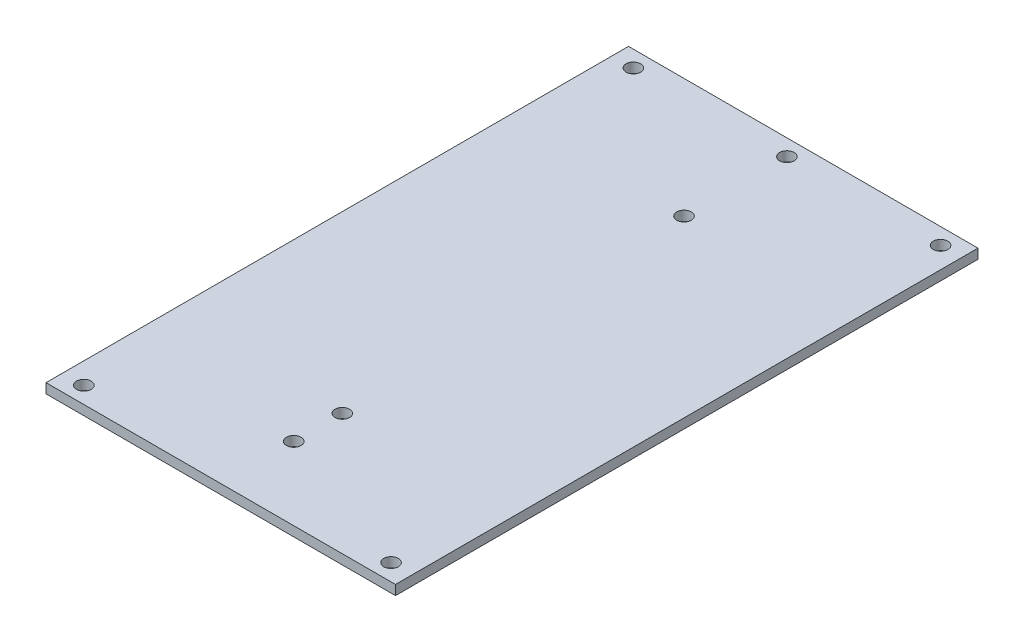
ISO-10303-21;
HEADER;
FILE_DESCRIPTION(('STEP AP214'),'2;1');
FILE_NAME('part.step','',(''),(''),'','','');
FILE_SCHEMA(('AUTOMOTIVE_DESIGN { 1 0 10303 214 1 1 1 1 }'));
ENDSEC;
DATA;
#1=APPLICATION_CONTEXT('core data for automotive mechanical design processes');
#2=APPLICATION_PROTOCOL_DEFINITION('international standard','automotive_design',2000,#1);
#3=PRODUCT_CONTEXT('',#1,'mechanical');
#4=PRODUCT('Part','Part','',(#3));
#5=PRODUCT_RELATED_PRODUCT_CATEGORY('part','',(#4));
#6=PRODUCT_DEFINITION_FORMATION('','',#4);
#7=PRODUCT_DEFINITION_CONTEXT('part definition',#1,'design');
#8=PRODUCT_DEFINITION('design','',#6,#7);
#9=PRODUCT_DEFINITION_SHAPE('','',#8);
#10=(LENGTH_UNIT() NAMED_UNIT(*) SI_UNIT(.MILLI.,.METRE.));
#11=(NAMED_UNIT(*) PLANE_ANGLE_UNIT() SI_UNIT($,.RADIAN.));
#12=(NAMED_UNIT(*) SI_UNIT($,.STERADIAN.) SOLID_ANGLE_UNIT());
#13=UNCERTAINTY_MEASURE_WITH_UNIT(LENGTH_MEASURE(1.E-05),#10,'distance_accuracy_value','');
#14=(GEOMETRIC_REPRESENTATION_CONTEXT(3) GLOBAL_UNCERTAINTY_ASSIGNED_CONTEXT((#13)) GLOBAL_UNIT_ASSIGNED_CONTEXT((#10,
#11,#12)) REPRESENTATION_CONTEXT('',''));
#15=CARTESIAN_POINT('',(0.,0.,0.));
#16=DIRECTION('',(0.,0.,1.));
#17=DIRECTION('',(1.,0.,0.));
#18=AXIS2_PLACEMENT_3D('',#15,#16,#17);
#19=CARTESIAN_POINT('',(-114.3,6.35,0.));
#20=DIRECTION('',(-1.,0.,0.));
#21=DIRECTION('',(0.,0.,1.));
#22=AXIS2_PLACEMENT_3D('',#19,#20,#21);
#23=PLANE('',#22);
#24=DIRECTION('',(0.,0.,-1.));
#25=VECTOR('',#24,1.);
#26=CARTESIAN_POINT('',(-114.3,0.,0.));
#27=LINE('',#26,#25);
#28=CARTESIAN_POINT('',(-114.3,0.,156.972));
#29=VERTEX_POINT('',#28);
#30=CARTESIAN_POINT('',(-114.3,0.,-224.028));
#31=VERTEX_POINT('',#30);
#32=EDGE_CURVE('E123',#29,#31,#27,.T.);
#33=ORIENTED_EDGE('',*,*,#32,.F.);
#34=DIRECTION('',(0.,-1.,0.));
#35=VECTOR('',#34,1.);
#36=CARTESIAN_POINT('',(-114.3,6.35,156.972));
#37=LINE('',#36,#35);
#38=CARTESIAN_POINT('',(-114.3,6.35,156.972));
#39=VERTEX_POINT('',#38);
#40=EDGE_CURVE('E11',#39,#29,#37,.T.);
#41=ORIENTED_EDGE('',*,*,#40,.F.);
#42=DIRECTION('',(0.,0.,-1.));
#43=VECTOR('',#42,1.);
#44=CARTESIAN_POINT('',(-114.3,6.35,0.));
#45=LINE('',#44,#43);
#46=CARTESIAN_POINT('',(-114.3,6.35,-224.028));
#47=VERTEX_POINT('',#46);
#48=EDGE_CURVE('E91',#39,#47,#45,.T.);
#49=ORIENTED_EDGE('',*,*,#48,.T.);
#50=DIRECTION('',(0.,-1.,0.));
#51=VECTOR('',#50,1.);
#52=CARTESIAN_POINT('',(-114.3,6.35,-224.028));
#53=LINE('',#52,#51);
#54=EDGE_CURVE('E52',#47,#31,#53,.T.);
#55=ORIENTED_EDGE('',*,*,#54,.T.);
#56=EDGE_LOOP('',(#33,#41,#49,#55));
#57=FACE_BOUND('',#56,.T.);
#58=ADVANCED_FACE('F35',(#57),#23,.T.);
#59=CARTESIAN_POINT('',(0.,6.35,156.972));
#60=DIRECTION('',(0.,0.,1.));
#61=DIRECTION('',(1.,0.,0.));
#62=AXIS2_PLACEMENT_3D('',#59,#60,#61);
#63=PLANE('',#62);
#64=DIRECTION('',(-1.,0.,0.));
#65=VECTOR('',#64,1.);
#66=CARTESIAN_POINT('',(0.,0.,156.972));
#67=LINE('',#66,#65);
#68=CARTESIAN_POINT('',(114.3,0.,156.972));
#69=VERTEX_POINT('',#68);
#70=EDGE_CURVE('E82',#69,#29,#67,.T.);
#71=ORIENTED_EDGE('',*,*,#70,.F.);
#72=DIRECTION('',(0.,-1.,0.));
#73=VECTOR('',#72,1.);
#74=CARTESIAN_POINT('',(114.3,6.35,156.972));
#75=LINE('',#74,#73);
#76=CARTESIAN_POINT('',(114.3,6.35,156.972));
#77=VERTEX_POINT('',#76);
#78=EDGE_CURVE('E44',#77,#69,#75,.T.);
#79=ORIENTED_EDGE('',*,*,#78,.F.);
#80=DIRECTION('',(-1.,0.,0.));
#81=VECTOR('',#80,1.);
#82=CARTESIAN_POINT('',(0.,6.35,156.972));
#83=LINE('',#82,#81);
#84=EDGE_CURVE('E80',#77,#39,#83,.T.);
#85=ORIENTED_EDGE('',*,*,#84,.T.);
#86=ORIENTED_EDGE('',*,*,#40,.T.);
#87=EDGE_LOOP('',(#71,#79,#85,#86));
#88=FACE_BOUND('',#87,.T.);
#89=ADVANCED_FACE('F79',(#88),#63,.T.);
#90=CARTESIAN_POINT('',(114.3,6.35,0.));
#91=DIRECTION('',(1.,0.,0.));
#92=DIRECTION('',(0.,0.,-1.));
#93=AXIS2_PLACEMENT_3D('',#90,#91,#92);
#94=PLANE('',#93);
#95=DIRECTION('',(0.,0.,1.));
#96=VECTOR('',#95,1.);
#97=CARTESIAN_POINT('',(114.3,0.,0.));
#98=LINE('',#97,#96);
#99=CARTESIAN_POINT('',(114.3,0.,-224.028));
#100=VERTEX_POINT('',#99);
#101=EDGE_CURVE('E126',#100,#69,#98,.T.);
#102=ORIENTED_EDGE('',*,*,#101,.F.);
#103=DIRECTION('',(0.,-1.,0.));
#104=VECTOR('',#103,1.);
#105=CARTESIAN_POINT('',(114.3,6.35,-224.028));
#106=LINE('',#105,#104);
#107=CARTESIAN_POINT('',(114.3,6.35,-224.028));
#108=VERTEX_POINT('',#107);
#109=EDGE_CURVE('E65',#108,#100,#106,.T.);
#110=ORIENTED_EDGE('',*,*,#109,.F.);
#111=DIRECTION('',(0.,0.,1.));
#112=VECTOR('',#111,1.);
#113=CARTESIAN_POINT('',(114.3,6.35,0.));
#114=LINE('',#113,#112);
#115=EDGE_CURVE('E90',#108,#77,#114,.T.);
#116=ORIENTED_EDGE('',*,*,#115,.T.);
#117=ORIENTED_EDGE('',*,*,#78,.T.);
#118=EDGE_LOOP('',(#102,#110,#116,#117));
#119=FACE_BOUND('',#118,.T.);
#120=ADVANCED_FACE('F93',(#119),#94,.T.);
#121=CARTESIAN_POINT('',(0.,6.35,-146.05));
#122=DIRECTION('',(0.,-1.,0.));
#123=DIRECTION('',(0.,0.,-1.));
#124=AXIS2_PLACEMENT_3D('',#121,#122,#123);
#125=CYLINDRICAL_SURFACE('',#124,4.7625);
#126=CARTESIAN_POINT('',(0.,6.35,-146.05));
#127=DIRECTION('',(0.,1.,0.));
#128=DIRECTION('',(0.,0.,1.));
#129=AXIS2_PLACEMENT_3D('',#126,#127,#128);
#130=CIRCLE('',#129,4.7625);
#131=CARTESIAN_POINT('',(0.,6.35,-141.2875));
#132=VERTEX_POINT('',#131);
#133=EDGE_CURVE('E157',#132,#132,#130,.T.);
#134=ORIENTED_EDGE('',*,*,#133,.T.);
#135=EDGE_LOOP('',(#134));
#136=FACE_BOUND('',#135,.T.);
#137=CARTESIAN_POINT('',(0.,0.,-146.05));
#138=DIRECTION('',(0.,1.,0.));
#139=DIRECTION('',(0.,0.,1.));
#140=AXIS2_PLACEMENT_3D('',#137,#138,#139);
#141=CIRCLE('',#140,4.7625);
#142=CARTESIAN_POINT('',(0.,0.,-141.2875));
#143=VERTEX_POINT('',#142);
#144=EDGE_CURVE('E120',#143,#143,#141,.T.);
#145=ORIENTED_EDGE('',*,*,#144,.F.);
#146=EDGE_LOOP('',(#145));
#147=FACE_BOUND('',#146,.T.);
#148=ADVANCED_FACE('F179',(#136,#147),#125,.F.);
#149=CARTESIAN_POINT('',(-100.457,6.35,146.05));
#150=DIRECTION('',(0.,-1.,0.));
#151=DIRECTION('',(0.,0.,-1.));
#152=AXIS2_PLACEMENT_3D('',#149,#150,#151);
#153=CYLINDRICAL_SURFACE('',#152,4.7625);
#154=CARTESIAN_POINT('',(-100.457,6.35,146.05));
#155=DIRECTION('',(0.,1.,0.));
#156=DIRECTION('',(0.,0.,1.));
#157=AXIS2_PLACEMENT_3D('',#154,#155,#156);
#158=CIRCLE('',#157,4.7625);
#159=CARTESIAN_POINT('',(-100.457,6.35,150.8125));
#160=VERTEX_POINT('',#159);
#161=EDGE_CURVE('E154',#160,#160,#158,.T.);
#162=ORIENTED_EDGE('',*,*,#161,.T.);
#163=EDGE_LOOP('',(#162));
#164=FACE_BOUND('',#163,.T.);
#165=CARTESIAN_POINT('',(-100.457,0.,146.05));
#166=DIRECTION('',(0.,1.,0.));
#167=DIRECTION('',(0.,0.,1.));
#168=AXIS2_PLACEMENT_3D('',#165,#166,#167);
#169=CIRCLE('',#168,4.7625);
#170=CARTESIAN_POINT('',(-100.457,0.,150.8125));
#171=VERTEX_POINT('',#170);
#172=EDGE_CURVE('E117',#171,#171,#169,.T.);
#173=ORIENTED_EDGE('',*,*,#172,.F.);
#174=EDGE_LOOP('',(#173));
#175=FACE_BOUND('',#174,.T.);
#176=ADVANCED_FACE('F182',(#164,#175),#153,.F.);
#177=CARTESIAN_POINT('',(0.,6.35,109.22));
#178=DIRECTION('',(0.,-1.,0.));
#179=DIRECTION('',(0.,0.,-1.));
#180=AXIS2_PLACEMENT_3D('',#177,#178,#179);
#181=CYLINDRICAL_SURFACE('',#180,4.7625);
#182=CARTESIAN_POINT('',(0.,6.35,109.22));
#183=DIRECTION('',(0.,1.,0.));
#184=DIRECTION('',(0.,0.,1.));
#185=AXIS2_PLACEMENT_3D('',#182,#183,#184);
#186=CIRCLE('',#185,4.7625);
#187=CARTESIAN_POINT('',(0.,6.35,113.9825));
#188=VERTEX_POINT('',#187);
#189=EDGE_CURVE('E151',#188,#188,#186,.T.);
#190=ORIENTED_EDGE('',*,*,#189,.T.);
#191=EDGE_LOOP('',(#190));
#192=FACE_BOUND('',#191,.T.);
#193=CARTESIAN_POINT('',(0.,0.,109.22));
#194=DIRECTION('',(0.,1.,0.));
#195=DIRECTION('',(0.,0.,1.));
#196=AXIS2_PLACEMENT_3D('',#193,#194,#195);
#197=CIRCLE('',#196,4.7625);
#198=CARTESIAN_POINT('',(0.,0.,113.9825));
#199=VERTEX_POINT('',#198);
#200=EDGE_CURVE('E114',#199,#199,#197,.T.);
#201=ORIENTED_EDGE('',*,*,#200,.F.);
#202=EDGE_LOOP('',(#201));
#203=FACE_BOUND('',#202,.T.);
#204=ADVANCED_FACE('F186',(#192,#203),#181,.F.);
#205=CARTESIAN_POINT('',(-100.457,6.35,-213.36));
#206=DIRECTION('',(0.,-1.,0.));
#207=DIRECTION('',(0.,0.,-1.));
#208=AXIS2_PLACEMENT_3D('',#205,#206,#207);
#209=CYLINDRICAL_SURFACE('',#208,4.7625);
#210=CARTESIAN_POINT('',(-100.457,6.35,-213.36));
#211=DIRECTION('',(0.,1.,0.));
#212=DIRECTION('',(0.,0.,1.));
#213=AXIS2_PLACEMENT_3D('',#210,#211,#212);
#214=CIRCLE('',#213,4.7625);
#215=CARTESIAN_POINT('',(-100.457,6.35,-208.5975));
#216=VERTEX_POINT('',#215);
#217=EDGE_CURVE('E148',#216,#216,#214,.T.);
#218=ORIENTED_EDGE('',*,*,#217,.T.);
#219=EDGE_LOOP('',(#218));
#220=FACE_BOUND('',#219,.T.);
#221=CARTESIAN_POINT('',(-100.457,0.,-213.36));
#222=DIRECTION('',(0.,1.,0.));
#223=DIRECTION('',(0.,0.,1.));
#224=AXIS2_PLACEMENT_3D('',#221,#222,#223);
#225=CIRCLE('',#224,4.7625);
#226=CARTESIAN_POINT('',(-100.457,0.,-208.5975));
#227=VERTEX_POINT('',#226);
#228=EDGE_CURVE('E111',#227,#227,#225,.T.);
#229=ORIENTED_EDGE('',*,*,#228,.F.);
#230=EDGE_LOOP('',(#229));
#231=FACE_BOUND('',#230,.T.);
#232=ADVANCED_FACE('F190',(#220,#231),#209,.F.);
#233=CARTESIAN_POINT('',(0.,6.35,77.47));
#234=DIRECTION('',(0.,-1.,0.));
#235=DIRECTION('',(0.,0.,-1.));
#236=AXIS2_PLACEMENT_3D('',#233,#234,#235);
#237=CYLINDRICAL_SURFACE('',#236,4.7625);
#238=CARTESIAN_POINT('',(0.,6.35,77.47));
#239=DIRECTION('',(0.,1.,0.));
#240=DIRECTION('',(0.,0.,1.));
#241=AXIS2_PLACEMENT_3D('',#238,#239,#240);
#242=CIRCLE('',#241,4.7625);
#243=CARTESIAN_POINT('',(0.,6.35,82.2325));
#244=VERTEX_POINT('',#243);
#245=EDGE_CURVE('E145',#244,#244,#242,.T.);
#246=ORIENTED_EDGE('',*,*,#245,.T.);
#247=EDGE_LOOP('',(#246));
#248=FACE_BOUND('',#247,.T.);
#249=CARTESIAN_POINT('',(0.,0.,77.47));
#250=DIRECTION('',(0.,1.,0.));
#251=DIRECTION('',(0.,0.,1.));
#252=AXIS2_PLACEMENT_3D('',#249,#250,#251);
#253=CIRCLE('',#252,4.7625);
#254=CARTESIAN_POINT('',(0.,0.,82.2325));
#255=VERTEX_POINT('',#254);
#256=EDGE_CURVE('E108',#255,#255,#253,.T.);
#257=ORIENTED_EDGE('',*,*,#256,.F.);
#258=EDGE_LOOP('',(#257));
#259=FACE_BOUND('',#258,.T.);
#260=ADVANCED_FACE('F194',(#248,#259),#237,.F.);
#261=CARTESIAN_POINT('',(100.457,6.35,146.05));
#262=DIRECTION('',(0.,-1.,0.));
#263=DIRECTION('',(0.,0.,-1.));
#264=AXIS2_PLACEMENT_3D('',#261,#262,#263);
#265=CYLINDRICAL_SURFACE('',#264,4.7625);
#266=CARTESIAN_POINT('',(100.457,6.35,146.05));
#267=DIRECTION('',(0.,1.,0.));
#268=DIRECTION('',(0.,0.,1.));
#269=AXIS2_PLACEMENT_3D('',#266,#267,#268);
#270=CIRCLE('',#269,4.7625);
#271=CARTESIAN_POINT('',(100.457,6.35,150.8125));
#272=VERTEX_POINT('',#271);
#273=EDGE_CURVE('E140',#272,#272,#270,.T.);
#274=ORIENTED_EDGE('',*,*,#273,.T.);
#275=EDGE_LOOP('',(#274));
#276=FACE_BOUND('',#275,.T.);
#277=CARTESIAN_POINT('',(100.457,0.,146.05));
#278=DIRECTION('',(0.,1.,0.));
#279=DIRECTION('',(0.,0.,1.));
#280=AXIS2_PLACEMENT_3D('',#277,#278,#279);
#281=CIRCLE('',#280,4.7625);
#282=CARTESIAN_POINT('',(100.457,0.,150.8125));
#283=VERTEX_POINT('',#282);
#284=EDGE_CURVE('E105',#283,#283,#281,.T.);
#285=ORIENTED_EDGE('',*,*,#284,.F.);
#286=EDGE_LOOP('',(#285));
#287=FACE_BOUND('',#286,.T.);
#288=ADVANCED_FACE('F198',(#276,#287),#265,.F.);
#289=CARTESIAN_POINT('',(0.,6.35,-213.36));
#290=DIRECTION('',(0.,-1.,0.));
#291=DIRECTION('',(0.,0.,-1.));
#292=AXIS2_PLACEMENT_3D('',#289,#290,#291);
#293=CYLINDRICAL_SURFACE('',#292,4.7625);
#294=CARTESIAN_POINT('',(0.,6.35,-213.36));
#295=DIRECTION('',(0.,1.,0.));
#296=DIRECTION('',(0.,0.,1.));
#297=AXIS2_PLACEMENT_3D('',#294,#295,#296);
#298=CIRCLE('',#297,4.7625);
#299=CARTESIAN_POINT('',(0.,6.35,-208.5975));
#300=VERTEX_POINT('',#299);
#301=EDGE_CURVE('E135',#300,#300,#298,.T.);
#302=ORIENTED_EDGE('',*,*,#301,.T.);
#303=EDGE_LOOP('',(#302));
#304=FACE_BOUND('',#303,.T.);
#305=CARTESIAN_POINT('',(0.,0.,-213.36));
#306=DIRECTION('',(0.,1.,0.));
#307=DIRECTION('',(0.,0.,1.));
#308=AXIS2_PLACEMENT_3D('',#305,#306,#307);
#309=CIRCLE('',#308,4.7625);
#310=CARTESIAN_POINT('',(0.,0.,-208.5975));
#311=VERTEX_POINT('',#310);
#312=EDGE_CURVE('E102',#311,#311,#309,.T.);
#313=ORIENTED_EDGE('',*,*,#312,.F.);
#314=EDGE_LOOP('',(#313));
#315=FACE_BOUND('',#314,.T.);
#316=ADVANCED_FACE('F169',(#304,#315),#293,.F.);
#317=CARTESIAN_POINT('',(100.457,6.35,-213.36));
#318=DIRECTION('',(0.,-1.,0.));
#319=DIRECTION('',(0.,0.,-1.));
#320=AXIS2_PLACEMENT_3D('',#317,#318,#319);
#321=CYLINDRICAL_SURFACE('',#320,4.7625);
#322=CARTESIAN_POINT('',(100.457,6.35,-213.36));
#323=DIRECTION('',(0.,1.,0.));
#324=DIRECTION('',(0.,0.,1.));
#325=AXIS2_PLACEMENT_3D('',#322,#323,#324);
#326=CIRCLE('',#325,4.7625);
#327=CARTESIAN_POINT('',(100.457,6.35,-208.5975));
#328=VERTEX_POINT('',#327);
#329=EDGE_CURVE('E131',#328,#328,#326,.T.);
#330=ORIENTED_EDGE('',*,*,#329,.T.);
#331=EDGE_LOOP('',(#330));
#332=FACE_BOUND('',#331,.T.);
#333=CARTESIAN_POINT('',(100.457,0.,-213.36));
#334=DIRECTION('',(0.,1.,0.));
#335=DIRECTION('',(0.,0.,1.));
#336=AXIS2_PLACEMENT_3D('',#333,#334,#335);
#337=CIRCLE('',#336,4.7625);
#338=CARTESIAN_POINT('',(100.457,0.,-208.5975));
#339=VERTEX_POINT('',#338);
#340=EDGE_CURVE('E99',#339,#339,#337,.T.);
#341=ORIENTED_EDGE('',*,*,#340,.F.);
#342=EDGE_LOOP('',(#341));
#343=FACE_BOUND('',#342,.T.);
#344=ADVANCED_FACE('F37',(#332,#343),#321,.F.);
#345=CARTESIAN_POINT('',(0.,6.35,-224.028));
#346=DIRECTION('',(0.,0.,-1.));
#347=DIRECTION('',(-1.,0.,0.));
#348=AXIS2_PLACEMENT_3D('',#345,#346,#347);
#349=PLANE('',#348);
#350=DIRECTION('',(1.,0.,0.));
#351=VECTOR('',#350,1.);
#352=CARTESIAN_POINT('',(0.,0.,-224.028));
#353=LINE('',#352,#351);
#354=EDGE_CURVE('E128',#31,#100,#353,.T.);
#355=ORIENTED_EDGE('',*,*,#354,.F.);
#356=ORIENTED_EDGE('',*,*,#54,.F.);
#357=DIRECTION('',(1.,0.,0.));
#358=VECTOR('',#357,1.);
#359=CARTESIAN_POINT('',(0.,6.35,-224.028));
#360=LINE('',#359,#358);
#361=EDGE_CURVE('E94',#47,#108,#360,.T.);
#362=ORIENTED_EDGE('',*,*,#361,.T.);
#363=ORIENTED_EDGE('',*,*,#109,.T.);
#364=EDGE_LOOP('',(#355,#356,#362,#363));
#365=FACE_BOUND('',#364,.T.);
#366=ADVANCED_FACE('F159',(#365),#349,.T.);
#367=CARTESIAN_POINT('',(0.,6.35,0.));
#368=DIRECTION('',(0.,1.,0.));
#369=DIRECTION('',(0.,0.,1.));
#370=AXIS2_PLACEMENT_3D('',#367,#368,#369);
#371=PLANE('',#370);
#372=ORIENTED_EDGE('',*,*,#329,.F.);
#373=EDGE_LOOP('',(#372));
#374=FACE_BOUND('',#373,.T.);
#375=ORIENTED_EDGE('',*,*,#301,.F.);
#376=EDGE_LOOP('',(#375));
#377=FACE_BOUND('',#376,.T.);
#378=ORIENTED_EDGE('',*,*,#273,.F.);
#379=EDGE_LOOP('',(#378));
#380=FACE_BOUND('',#379,.T.);
#381=ORIENTED_EDGE('',*,*,#245,.F.);
#382=EDGE_LOOP('',(#381));
#383=FACE_BOUND('',#382,.T.);
#384=ORIENTED_EDGE('',*,*,#217,.F.);
#385=EDGE_LOOP('',(#384));
#386=FACE_BOUND('',#385,.T.);
#387=ORIENTED_EDGE('',*,*,#189,.F.);
#388=EDGE_LOOP('',(#387));
#389=FACE_BOUND('',#388,.T.);
#390=ORIENTED_EDGE('',*,*,#161,.F.);
#391=EDGE_LOOP('',(#390));
#392=FACE_BOUND('',#391,.T.);
#393=ORIENTED_EDGE('',*,*,#133,.F.);
#394=EDGE_LOOP('',(#393));
#395=FACE_BOUND('',#394,.T.);
#396=ORIENTED_EDGE('',*,*,#48,.F.);
#397=ORIENTED_EDGE('',*,*,#84,.F.);
#398=ORIENTED_EDGE('',*,*,#115,.F.);
#399=ORIENTED_EDGE('',*,*,#361,.F.);
#400=EDGE_LOOP('',(#396,#397,#398,#399));
#401=FACE_BOUND('',#400,.T.);
#402=ADVANCED_FACE('F88',(#374,#377,#380,#383,#386,#389,#392,#395,#401),#371,.T.);
#403=CARTESIAN_POINT('',(0.,0.,0.));
#404=DIRECTION('',(0.,1.,0.));
#405=DIRECTION('',(0.,0.,1.));
#406=AXIS2_PLACEMENT_3D('',#403,#404,#405);
#407=PLANE('',#406);
#408=ORIENTED_EDGE('',*,*,#340,.T.);
#409=EDGE_LOOP('',(#408));
#410=FACE_BOUND('',#409,.T.);
#411=ORIENTED_EDGE('',*,*,#312,.T.);
#412=EDGE_LOOP('',(#411));
#413=FACE_BOUND('',#412,.T.);
#414=ORIENTED_EDGE('',*,*,#284,.T.);
#415=EDGE_LOOP('',(#414));
#416=FACE_BOUND('',#415,.T.);
#417=ORIENTED_EDGE('',*,*,#256,.T.);
#418=EDGE_LOOP('',(#417));
#419=FACE_BOUND('',#418,.T.);
#420=ORIENTED_EDGE('',*,*,#228,.T.);
#421=EDGE_LOOP('',(#420));
#422=FACE_BOUND('',#421,.T.);
#423=ORIENTED_EDGE('',*,*,#200,.T.);
#424=EDGE_LOOP('',(#423));
#425=FACE_BOUND('',#424,.T.);
#426=ORIENTED_EDGE('',*,*,#172,.T.);
#427=EDGE_LOOP('',(#426));
#428=FACE_BOUND('',#427,.T.);
#429=ORIENTED_EDGE('',*,*,#144,.T.);
#430=EDGE_LOOP('',(#429));
#431=FACE_BOUND('',#430,.T.);
#432=ORIENTED_EDGE('',*,*,#32,.T.);
#433=ORIENTED_EDGE('',*,*,#354,.T.);
#434=ORIENTED_EDGE('',*,*,#101,.T.);
#435=ORIENTED_EDGE('',*,*,#70,.T.);
#436=EDGE_LOOP('',(#432,#433,#434,#435));
#437=FACE_BOUND('',#436,.T.);
#438=ADVANCED_FACE('F166',(#410,#413,#416,#419,#422,#425,#428,#431,#437),#407,.F.);
#439=CLOSED_SHELL('',(#58,#89,#120,#148,#176,#204,#232,#260,#288,#316,#344,#366,#402,#438));
#440=MANIFOLD_SOLID_BREP('B2',#439);
#441=ADVANCED_BREP_SHAPE_REPRESENTATION('',(#18,#440),#14);
#442=SHAPE_DEFINITION_REPRESENTATION(#9,#441);
ENDSEC;
END-ISO-10303-21;
